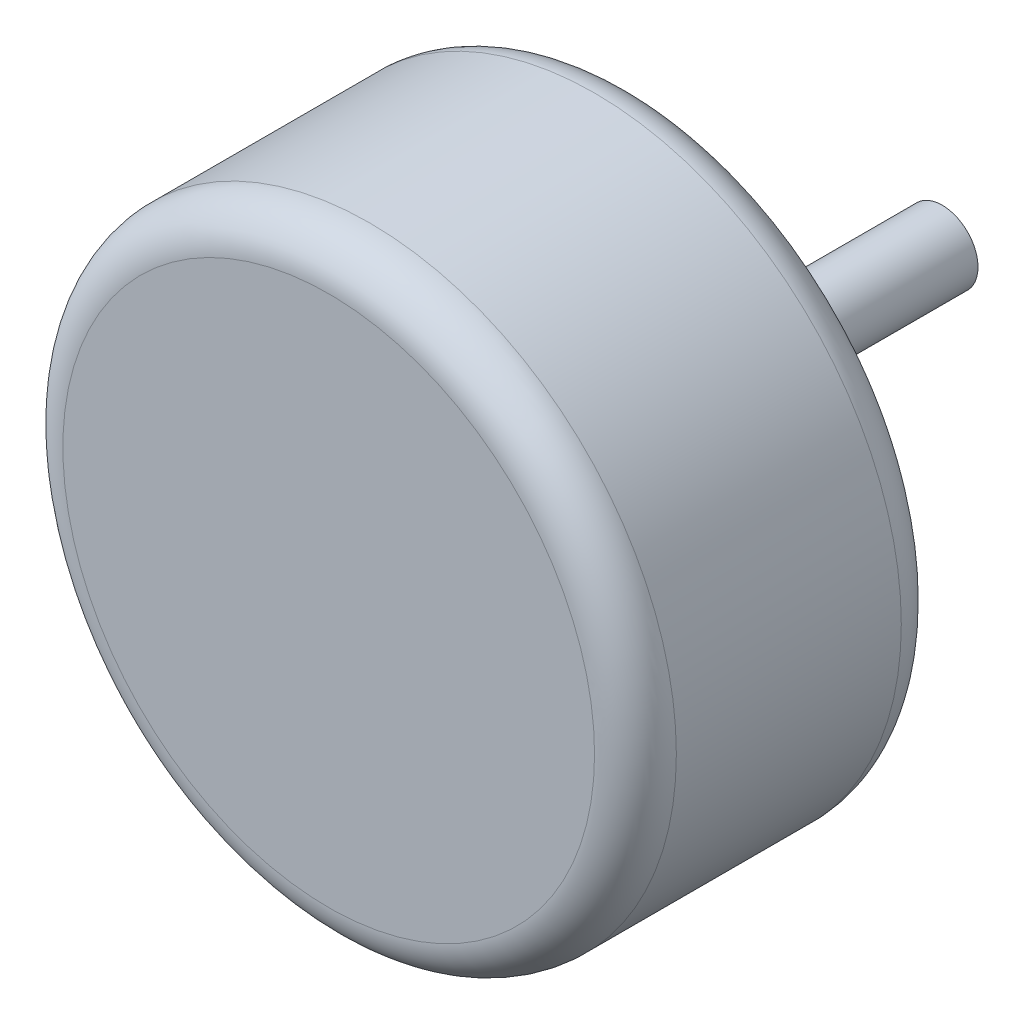
ISO-10303-21;
HEADER;
FILE_DESCRIPTION(('STEP AP214'),'2;1');
FILE_NAME('part.step','',(''),(''),'','','');
FILE_SCHEMA(('AUTOMOTIVE_DESIGN { 1 0 10303 214 1 1 1 1 }'));
ENDSEC;
DATA;
#1=APPLICATION_CONTEXT('core data for automotive mechanical design processes');
#2=APPLICATION_PROTOCOL_DEFINITION('international standard','automotive_design',2000,#1);
#3=PRODUCT_CONTEXT('',#1,'mechanical');
#4=PRODUCT('Part','Part','',(#3));
#5=PRODUCT_RELATED_PRODUCT_CATEGORY('part','',(#4));
#6=PRODUCT_DEFINITION_FORMATION('','',#4);
#7=PRODUCT_DEFINITION_CONTEXT('part definition',#1,'design');
#8=PRODUCT_DEFINITION('design','',#6,#7);
#9=PRODUCT_DEFINITION_SHAPE('','',#8);
#10=(LENGTH_UNIT() NAMED_UNIT(*) SI_UNIT(.MILLI.,.METRE.));
#11=(NAMED_UNIT(*) PLANE_ANGLE_UNIT() SI_UNIT($,.RADIAN.));
#12=(NAMED_UNIT(*) SI_UNIT($,.STERADIAN.) SOLID_ANGLE_UNIT());
#13=UNCERTAINTY_MEASURE_WITH_UNIT(LENGTH_MEASURE(1.E-05),#10,'distance_accuracy_value','');
#14=(GEOMETRIC_REPRESENTATION_CONTEXT(3) GLOBAL_UNCERTAINTY_ASSIGNED_CONTEXT((#13)) GLOBAL_UNIT_ASSIGNED_CONTEXT((#10,
#11,#12)) REPRESENTATION_CONTEXT('',''));
#15=CARTESIAN_POINT('',(0.,0.,0.));
#16=DIRECTION('',(0.,0.,1.));
#17=DIRECTION('',(1.,0.,0.));
#18=AXIS2_PLACEMENT_3D('',#15,#16,#17);
#19=CARTESIAN_POINT('',(0.,0.,76.2));
#20=DIRECTION('',(0.,0.,-1.));
#21=DIRECTION('',(-1.,0.,0.));
#22=AXIS2_PLACEMENT_3D('',#19,#20,#21);
#23=CYLINDRICAL_SURFACE('',#22,76.2);
#24=CARTESIAN_POINT('',(0.,0.,10.16));
#25=DIRECTION('',(0.,0.,1.));
#26=DIRECTION('',(1.,0.,0.));
#27=AXIS2_PLACEMENT_3D('',#24,#25,#26);
#28=CIRCLE('',#27,76.2);
#29=CARTESIAN_POINT('',(-76.2,0.,10.16));
#30=VERTEX_POINT('',#29);
#31=EDGE_CURVE('E43',#30,#30,#28,.T.);
#32=CARTESIAN_POINT('',(0.,0.,66.04));
#33=DIRECTION('',(0.,0.,1.));
#34=DIRECTION('',(1.,0.,0.));
#35=AXIS2_PLACEMENT_3D('',#32,#33,#34);
#36=CIRCLE('',#35,76.2);
#37=CARTESIAN_POINT('',(-76.2,0.,66.04));
#38=VERTEX_POINT('',#37);
#39=EDGE_CURVE('E47',#38,#38,#36,.F.);
#40=CARTESIAN_POINT('',(-76.2,0.,10.16));
#41=CARTESIAN_POINT('',(-76.2,0.,10.7420833333333));
#42=CARTESIAN_POINT('',(-76.2,0.,11.3241666666667));
#43=CARTESIAN_POINT('',(-76.2,0.,12.4883333333333));
#44=CARTESIAN_POINT('',(-76.2,0.,13.0704166666667));
#45=CARTESIAN_POINT('',(-76.2,0.,14.2345833333333));
#46=CARTESIAN_POINT('',(-76.2,0.,14.8166666666667));
#47=CARTESIAN_POINT('',(-76.2,0.,15.9808333333333));
#48=CARTESIAN_POINT('',(-76.2,0.,16.5629166666667));
#49=CARTESIAN_POINT('',(-76.2,0.,17.7270833333333));
#50=CARTESIAN_POINT('',(-76.2,0.,18.3091666666667));
#51=CARTESIAN_POINT('',(-76.2,0.,19.4733333333333));
#52=CARTESIAN_POINT('',(-76.2,0.,20.0554166666667));
#53=CARTESIAN_POINT('',(-76.2,0.,21.2195833333333));
#54=CARTESIAN_POINT('',(-76.2,0.,21.8016666666667));
#55=CARTESIAN_POINT('',(-76.2,0.,22.9658333333333));
#56=CARTESIAN_POINT('',(-76.2,0.,23.5479166666667));
#57=CARTESIAN_POINT('',(-76.2,0.,24.7120833333333));
#58=CARTESIAN_POINT('',(-76.2,0.,25.2941666666667));
#59=CARTESIAN_POINT('',(-76.2,0.,26.4583333333333));
#60=CARTESIAN_POINT('',(-76.2,0.,27.0404166666667));
#61=CARTESIAN_POINT('',(-76.2,0.,28.2045833333333));
#62=CARTESIAN_POINT('',(-76.2,0.,28.7866666666667));
#63=CARTESIAN_POINT('',(-76.2,0.,29.9508333333333));
#64=CARTESIAN_POINT('',(-76.2,0.,30.5329166666667));
#65=CARTESIAN_POINT('',(-76.2,0.,31.6970833333333));
#66=CARTESIAN_POINT('',(-76.2,0.,32.2791666666667));
#67=CARTESIAN_POINT('',(-76.2,0.,33.4433333333333));
#68=CARTESIAN_POINT('',(-76.2,0.,34.0254166666667));
#69=CARTESIAN_POINT('',(-76.2,0.,35.1895833333333));
#70=CARTESIAN_POINT('',(-76.2,0.,35.7716666666667));
#71=CARTESIAN_POINT('',(-76.2,0.,36.9358333333333));
#72=CARTESIAN_POINT('',(-76.2,0.,37.5179166666667));
#73=CARTESIAN_POINT('',(-76.2,0.,38.6820833333333));
#74=CARTESIAN_POINT('',(-76.2,0.,39.2641666666667));
#75=CARTESIAN_POINT('',(-76.2,0.,40.4283333333333));
#76=CARTESIAN_POINT('',(-76.2,0.,41.0104166666667));
#77=CARTESIAN_POINT('',(-76.2,0.,42.1745833333333));
#78=CARTESIAN_POINT('',(-76.2,0.,42.7566666666667));
#79=CARTESIAN_POINT('',(-76.2,0.,43.9208333333333));
#80=CARTESIAN_POINT('',(-76.2,0.,44.5029166666667));
#81=CARTESIAN_POINT('',(-76.2,0.,45.6670833333333));
#82=CARTESIAN_POINT('',(-76.2,0.,46.2491666666667));
#83=CARTESIAN_POINT('',(-76.2,0.,47.4133333333333));
#84=CARTESIAN_POINT('',(-76.2,0.,47.9954166666667));
#85=CARTESIAN_POINT('',(-76.2,0.,49.1595833333333));
#86=CARTESIAN_POINT('',(-76.2,0.,49.7416666666667));
#87=CARTESIAN_POINT('',(-76.2,0.,50.9058333333333));
#88=CARTESIAN_POINT('',(-76.2,0.,51.4879166666667));
#89=CARTESIAN_POINT('',(-76.2,0.,52.6520833333333));
#90=CARTESIAN_POINT('',(-76.2,0.,53.2341666666667));
#91=CARTESIAN_POINT('',(-76.2,0.,54.3983333333333));
#92=CARTESIAN_POINT('',(-76.2,0.,54.9804166666667));
#93=CARTESIAN_POINT('',(-76.2,0.,56.1445833333333));
#94=CARTESIAN_POINT('',(-76.2,0.,56.7266666666667));
#95=CARTESIAN_POINT('',(-76.2,0.,57.8908333333333));
#96=CARTESIAN_POINT('',(-76.2,0.,58.4729166666667));
#97=CARTESIAN_POINT('',(-76.2,0.,59.6370833333333));
#98=CARTESIAN_POINT('',(-76.2,0.,60.2191666666667));
#99=CARTESIAN_POINT('',(-76.2,0.,61.3833333333333));
#100=CARTESIAN_POINT('',(-76.2,0.,61.9654166666667));
#101=CARTESIAN_POINT('',(-76.2,0.,63.1295833333333));
#102=CARTESIAN_POINT('',(-76.2,0.,63.7116666666667));
#103=CARTESIAN_POINT('',(-76.2,0.,64.8758333333333));
#104=CARTESIAN_POINT('',(-76.2,0.,65.4579166666667));
#105=CARTESIAN_POINT('',(-76.2,0.,66.04));
#106=B_SPLINE_CURVE_WITH_KNOTS('',3,(#40,#41,#42,#43,#44,#45,#46,#47,#48,#49,#50,#51,#52,#53,
#54,#55,#56,#57,#58,#59,#60,#61,#62,#63,#64,#65,#66,#67,#68,#69,#70,#71,#72,#73,#74,#75,#76,#77,
#78,#79,#80,#81,#82,#83,#84,#85,#86,#87,#88,#89,#90,#91,#92,#93,#94,#95,#96,#97,#98,#99,#100,
#101,#102,#103,#104,#105),.UNSPECIFIED.,.F.,.F.,(4,2,2,2,2,2,2,2,2,2,2,2,2,2,2,2,2,2,2,2,2,2,2,
2,2,2,2,2,2,2,2,2,4),(0.,1.74625,3.4925,5.23874999999999,6.98499999999999,8.73125,10.4775,
12.22375,13.97,15.71625,17.4625,19.20875,20.955,22.70125,24.4475,26.19375,27.94,29.68625,
31.4325,33.17875,34.925,36.67125,38.4175,40.16375,41.91,43.65625,45.4025,47.14875,48.895,
50.64125,52.3875,54.13375,55.88),.UNSPECIFIED.);
#107=EDGE_CURVE('BSEAM36',#30,#38,#106,.T.);
#108=ORIENTED_EDGE('',*,*,#31,.T.);
#109=ORIENTED_EDGE('',*,*,#39,.T.);
#110=ORIENTED_EDGE('',*,*,#107,.T.);
#111=ORIENTED_EDGE('',*,*,#107,.F.);
#112=EDGE_LOOP('',(#108,#110,#109,#111));
#113=FACE_BOUND('',#112,.T.);
#114=ADVANCED_FACE('F36',(#113),#23,.T.);
#115=CARTESIAN_POINT('',(0.,0.,76.2));
#116=DIRECTION('',(0.,0.,1.));
#117=DIRECTION('',(1.,0.,0.));
#118=AXIS2_PLACEMENT_3D('',#115,#116,#117);
#119=PLANE('',#118);
#120=CARTESIAN_POINT('',(0.,0.,76.2));
#121=DIRECTION('',(0.,0.,1.));
#122=DIRECTION('',(1.,0.,0.));
#123=AXIS2_PLACEMENT_3D('',#120,#121,#122);
#124=CIRCLE('',#123,66.04);
#125=CARTESIAN_POINT('',(66.04,0.,76.2));
#126=VERTEX_POINT('',#125);
#127=EDGE_CURVE('E51',#126,#126,#124,.T.);
#128=ORIENTED_EDGE('',*,*,#127,.T.);
#129=EDGE_LOOP('',(#128));
#130=FACE_BOUND('',#129,.T.);
#131=ADVANCED_FACE('F73',(#130),#119,.T.);
#132=CARTESIAN_POINT('',(0.,0.,0.));
#133=DIRECTION('',(0.,0.,1.));
#134=DIRECTION('',(1.,0.,0.));
#135=AXIS2_PLACEMENT_3D('',#132,#133,#134);
#136=PLANE('',#135);
#137=CARTESIAN_POINT('',(0.,0.,0.));
#138=DIRECTION('',(0.,0.,1.));
#139=DIRECTION('',(1.,0.,0.));
#140=AXIS2_PLACEMENT_3D('',#137,#138,#139);
#141=CIRCLE('',#140,66.04);
#142=CARTESIAN_POINT('',(66.04,0.,0.));
#143=VERTEX_POINT('',#142);
#144=EDGE_CURVE('E10',#143,#143,#141,.F.);
#145=ORIENTED_EDGE('',*,*,#144,.T.);
#146=EDGE_LOOP('',(#145));
#147=FACE_BOUND('',#146,.T.);
#148=CARTESIAN_POINT('',(0.,0.,0.));
#149=DIRECTION('',(0.,0.,1.));
#150=DIRECTION('',(1.,0.,0.));
#151=AXIS2_PLACEMENT_3D('',#148,#149,#150);
#152=CIRCLE('',#151,8.88999999999999);
#153=CARTESIAN_POINT('',(8.88999999999999,0.,0.));
#154=VERTEX_POINT('',#153);
#155=EDGE_CURVE('E56',#154,#154,#152,.F.);
#156=ORIENTED_EDGE('',*,*,#155,.F.);
#157=EDGE_LOOP('',(#156));
#158=FACE_BOUND('',#157,.T.);
#159=ADVANCED_FACE('F68',(#147,#158),#136,.F.);
#160=CARTESIAN_POINT('',(0.,0.,-76.2));
#161=DIRECTION('',(0.,0.,1.));
#162=DIRECTION('',(1.,0.,0.));
#163=AXIS2_PLACEMENT_3D('',#160,#161,#162);
#164=CYLINDRICAL_SURFACE('',#163,8.88999999999999);
#165=CARTESIAN_POINT('',(0.,0.,-76.2));
#166=DIRECTION('',(0.,0.,-1.));
#167=DIRECTION('',(-1.,0.,0.));
#168=AXIS2_PLACEMENT_3D('',#165,#166,#167);
#169=CIRCLE('',#168,8.88999999999999);
#170=CARTESIAN_POINT('',(8.88999999999999,0.,-76.2));
#171=VERTEX_POINT('',#170);
#172=EDGE_CURVE('E59',#171,#171,#169,.T.);
#173=CARTESIAN_POINT('',(8.88999999999999,0.,-76.2));
#174=CARTESIAN_POINT('',(8.88999999999999,0.,-75.40625));
#175=CARTESIAN_POINT('',(8.88999999999999,0.,-74.6125));
#176=CARTESIAN_POINT('',(8.88999999999999,0.,-73.025));
#177=CARTESIAN_POINT('',(8.88999999999999,0.,-72.23125));
#178=CARTESIAN_POINT('',(8.88999999999999,0.,-70.64375));
#179=CARTESIAN_POINT('',(8.88999999999999,0.,-69.85));
#180=CARTESIAN_POINT('',(8.88999999999999,0.,-68.2625));
#181=CARTESIAN_POINT('',(8.88999999999999,0.,-67.46875));
#182=CARTESIAN_POINT('',(8.88999999999999,0.,-65.88125));
#183=CARTESIAN_POINT('',(8.88999999999999,0.,-65.0875));
#184=CARTESIAN_POINT('',(8.88999999999999,0.,-63.5));
#185=CARTESIAN_POINT('',(8.88999999999999,0.,-62.70625));
#186=CARTESIAN_POINT('',(8.88999999999999,0.,-61.11875));
#187=CARTESIAN_POINT('',(8.88999999999999,0.,-60.325));
#188=CARTESIAN_POINT('',(8.88999999999999,0.,-58.7375));
#189=CARTESIAN_POINT('',(8.88999999999999,0.,-57.94375));
#190=CARTESIAN_POINT('',(8.88999999999999,0.,-56.35625));
#191=CARTESIAN_POINT('',(8.88999999999999,0.,-55.5625));
#192=CARTESIAN_POINT('',(8.88999999999999,0.,-53.975));
#193=CARTESIAN_POINT('',(8.88999999999999,0.,-53.18125));
#194=CARTESIAN_POINT('',(8.88999999999999,0.,-51.59375));
#195=CARTESIAN_POINT('',(8.88999999999999,0.,-50.8));
#196=CARTESIAN_POINT('',(8.88999999999999,0.,-49.2125));
#197=CARTESIAN_POINT('',(8.88999999999999,0.,-48.41875));
#198=CARTESIAN_POINT('',(8.88999999999999,0.,-46.83125));
#199=CARTESIAN_POINT('',(8.88999999999999,0.,-46.0375));
#200=CARTESIAN_POINT('',(8.88999999999999,0.,-44.45));
#201=CARTESIAN_POINT('',(8.88999999999999,0.,-43.65625));
#202=CARTESIAN_POINT('',(8.88999999999999,0.,-42.06875));
#203=CARTESIAN_POINT('',(8.88999999999999,0.,-41.275));
#204=CARTESIAN_POINT('',(8.88999999999999,0.,-39.6875));
#205=CARTESIAN_POINT('',(8.88999999999999,0.,-38.89375));
#206=CARTESIAN_POINT('',(8.88999999999999,0.,-37.30625));
#207=CARTESIAN_POINT('',(8.88999999999999,0.,-36.5125));
#208=CARTESIAN_POINT('',(8.88999999999999,0.,-34.925));
#209=CARTESIAN_POINT('',(8.88999999999999,0.,-34.13125));
#210=CARTESIAN_POINT('',(8.88999999999999,0.,-32.54375));
#211=CARTESIAN_POINT('',(8.88999999999999,0.,-31.75));
#212=CARTESIAN_POINT('',(8.88999999999999,0.,-30.1625));
#213=CARTESIAN_POINT('',(8.88999999999999,0.,-29.36875));
#214=CARTESIAN_POINT('',(8.88999999999999,0.,-27.78125));
#215=CARTESIAN_POINT('',(8.88999999999999,0.,-26.9875));
#216=CARTESIAN_POINT('',(8.88999999999999,0.,-25.4));
#217=CARTESIAN_POINT('',(8.88999999999999,0.,-24.60625));
#218=CARTESIAN_POINT('',(8.88999999999999,0.,-23.01875));
#219=CARTESIAN_POINT('',(8.88999999999999,0.,-22.225));
#220=CARTESIAN_POINT('',(8.88999999999999,0.,-20.6375));
#221=CARTESIAN_POINT('',(8.88999999999999,0.,-19.84375));
#222=CARTESIAN_POINT('',(8.88999999999999,0.,-18.25625));
#223=CARTESIAN_POINT('',(8.88999999999999,0.,-17.4625));
#224=CARTESIAN_POINT('',(8.88999999999999,0.,-15.875));
#225=CARTESIAN_POINT('',(8.88999999999999,0.,-15.08125));
#226=CARTESIAN_POINT('',(8.88999999999999,0.,-13.49375));
#227=CARTESIAN_POINT('',(8.88999999999999,0.,-12.7));
#228=CARTESIAN_POINT('',(8.88999999999999,0.,-11.1125));
#229=CARTESIAN_POINT('',(8.88999999999999,0.,-10.31875));
#230=CARTESIAN_POINT('',(8.88999999999999,0.,-8.73125));
#231=CARTESIAN_POINT('',(8.88999999999999,0.,-7.93750000000001));
#232=CARTESIAN_POINT('',(8.88999999999999,0.,-6.35));
#233=CARTESIAN_POINT('',(8.88999999999999,0.,-5.55625));
#234=CARTESIAN_POINT('',(8.88999999999999,0.,-3.96875));
#235=CARTESIAN_POINT('',(8.88999999999999,0.,-3.175));
#236=CARTESIAN_POINT('',(8.88999999999999,0.,-1.5875));
#237=CARTESIAN_POINT('',(8.88999999999999,0.,-0.793750000000001));
#238=CARTESIAN_POINT('',(8.88999999999999,0.,0.));
#239=B_SPLINE_CURVE_WITH_KNOTS('',3,(#173,#174,#175,#176,#177,#178,#179,#180,#181,#182,#183,
#184,#185,#186,#187,#188,#189,#190,#191,#192,#193,#194,#195,#196,#197,#198,#199,#200,#201,#202,
#203,#204,#205,#206,#207,#208,#209,#210,#211,#212,#213,#214,#215,#216,#217,#218,#219,#220,#221,
#222,#223,#224,#225,#226,#227,#228,#229,#230,#231,#232,#233,#234,#235,#236,#237,#238),
.UNSPECIFIED.,.F.,.F.,(4,2,2,2,2,2,2,2,2,2,2,2,2,2,2,2,2,2,2,2,2,2,2,2,2,2,2,2,2,2,2,2,4),(0.,
2.38124999999999,4.76249999999999,7.14374999999999,9.52499999999999,11.90625,14.2875,16.66875,
19.05,21.43125,23.8125,26.19375,28.575,30.95625,33.3375,35.71875,38.1,40.48125,42.8625,45.24375,
47.625,50.00625,52.3875,54.76875,57.15,59.53125,61.9125,64.29375,66.675,69.05625,71.4375,
73.81875,76.2),.UNSPECIFIED.);
#240=EDGE_CURVE('BSEAM65',#171,#154,#239,.T.);
#241=ORIENTED_EDGE('',*,*,#172,.F.);
#242=ORIENTED_EDGE('',*,*,#155,.T.);
#243=ORIENTED_EDGE('',*,*,#240,.T.);
#244=ORIENTED_EDGE('',*,*,#240,.F.);
#245=EDGE_LOOP('',(#241,#243,#242,#244));
#246=FACE_BOUND('',#245,.T.);
#247=ADVANCED_FACE('F65',(#246),#164,.T.);
#248=CARTESIAN_POINT('',(0.,0.,-76.2));
#249=DIRECTION('',(0.,0.,-1.));
#250=DIRECTION('',(-1.,0.,0.));
#251=AXIS2_PLACEMENT_3D('',#248,#249,#250);
#252=PLANE('',#251);
#253=ORIENTED_EDGE('',*,*,#172,.T.);
#254=EDGE_LOOP('',(#253));
#255=FACE_BOUND('',#254,.T.);
#256=ADVANCED_FACE('F63',(#255),#252,.T.);
#257=CARTESIAN_POINT('',(0.,0.,66.04));
#258=DIRECTION('',(0.,0.,1.));
#259=DIRECTION('',(1.,0.,0.));
#260=AXIS2_PLACEMENT_3D('',#257,#258,#259);
#261=TOROIDAL_SURFACE('',#260,66.04,10.16);
#262=ORIENTED_EDGE('',*,*,#39,.F.);
#263=EDGE_LOOP('',(#262));
#264=FACE_BOUND('',#263,.T.);
#265=ORIENTED_EDGE('',*,*,#127,.F.);
#266=EDGE_LOOP('',(#265));
#267=FACE_BOUND('',#266,.T.);
#268=ADVANCED_FACE('F85',(#264,#267),#261,.T.);
#269=CARTESIAN_POINT('',(0.,0.,10.16));
#270=DIRECTION('',(0.,0.,1.));
#271=DIRECTION('',(1.,0.,0.));
#272=AXIS2_PLACEMENT_3D('',#269,#270,#271);
#273=TOROIDAL_SURFACE('',#272,66.04,10.16);
#274=ORIENTED_EDGE('',*,*,#144,.F.);
#275=EDGE_LOOP('',(#274));
#276=FACE_BOUND('',#275,.T.);
#277=ORIENTED_EDGE('',*,*,#31,.F.);
#278=EDGE_LOOP('',(#277));
#279=FACE_BOUND('',#278,.T.);
#280=ADVANCED_FACE('F38',(#276,#279),#273,.T.);
#281=CLOSED_SHELL('',(#114,#131,#159,#247,#256,#268,#280));
#282=MANIFOLD_SOLID_BREP('B2',#281);
#283=ADVANCED_BREP_SHAPE_REPRESENTATION('',(#18,#282),#14);
#284=SHAPE_DEFINITION_REPRESENTATION(#9,#283);
ENDSEC;
END-ISO-10303-21;
